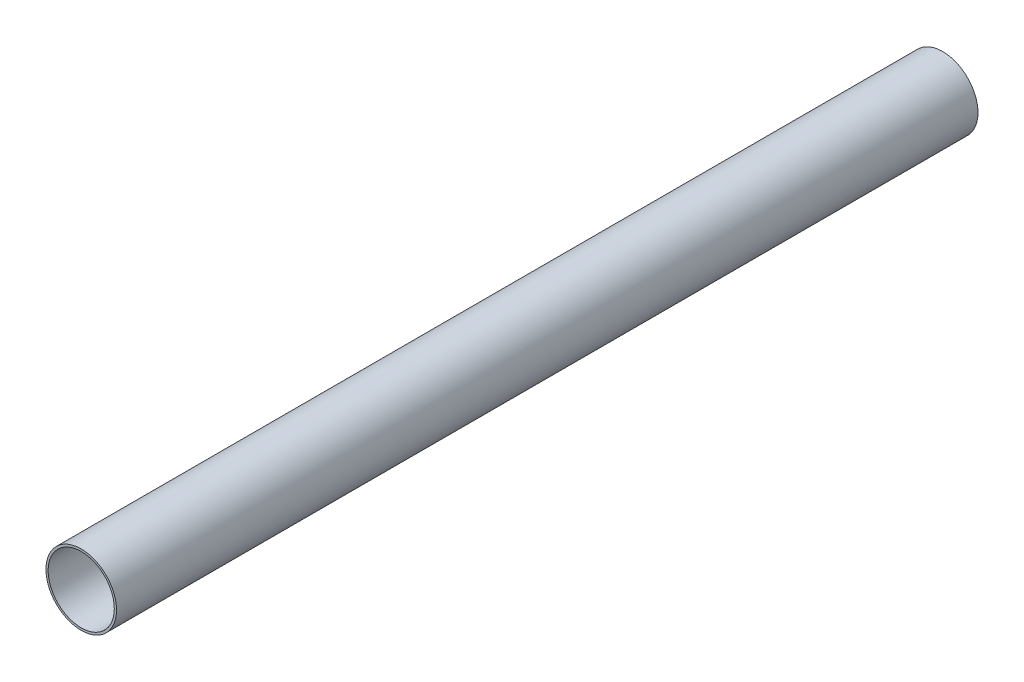
ISO-10303-21;
HEADER;
FILE_DESCRIPTION(('STEP AP214'),'2;1');
FILE_NAME('part.step','',(''),(''),'','','');
FILE_SCHEMA(('AUTOMOTIVE_DESIGN { 1 0 10303 214 1 1 1 1 }'));
ENDSEC;
DATA;
#1=APPLICATION_CONTEXT('core data for automotive mechanical design processes');
#2=APPLICATION_PROTOCOL_DEFINITION('international standard','automotive_design',2000,#1);
#3=PRODUCT_CONTEXT('',#1,'mechanical');
#4=PRODUCT('Part','Part','',(#3));
#5=PRODUCT_RELATED_PRODUCT_CATEGORY('part','',(#4));
#6=PRODUCT_DEFINITION_FORMATION('','',#4);
#7=PRODUCT_DEFINITION_CONTEXT('part definition',#1,'design');
#8=PRODUCT_DEFINITION('design','',#6,#7);
#9=PRODUCT_DEFINITION_SHAPE('','',#8);
#10=(LENGTH_UNIT() NAMED_UNIT(*) SI_UNIT(.MILLI.,.METRE.));
#11=(NAMED_UNIT(*) PLANE_ANGLE_UNIT() SI_UNIT($,.RADIAN.));
#12=(NAMED_UNIT(*) SI_UNIT($,.STERADIAN.) SOLID_ANGLE_UNIT());
#13=UNCERTAINTY_MEASURE_WITH_UNIT(LENGTH_MEASURE(1.E-05),#10,'distance_accuracy_value','');
#14=(GEOMETRIC_REPRESENTATION_CONTEXT(3) GLOBAL_UNCERTAINTY_ASSIGNED_CONTEXT((#13)) GLOBAL_UNIT_ASSIGNED_CONTEXT((#10,
#11,#12)) REPRESENTATION_CONTEXT('',''));
#15=CARTESIAN_POINT('',(0.,0.,0.));
#16=DIRECTION('',(0.,0.,1.));
#17=DIRECTION('',(1.,0.,0.));
#18=AXIS2_PLACEMENT_3D('',#15,#16,#17);
#19=CARTESIAN_POINT('',(0.,0.,1241.2726));
#20=DIRECTION('',(0.,0.,1.));
#21=DIRECTION('',(1.,0.,0.));
#22=AXIS2_PLACEMENT_3D('',#19,#20,#21);
#23=PLANE('',#22);
#24=CARTESIAN_POINT('',(0.,0.,1241.2726));
#25=DIRECTION('',(0.,0.,1.));
#26=DIRECTION('',(1.,0.,0.));
#27=AXIS2_PLACEMENT_3D('',#24,#25,#26);
#28=CIRCLE('',#27,50.8381);
#29=CARTESIAN_POINT('',(50.8381,0.,1241.2726));
#30=VERTEX_POINT('',#29);
#31=EDGE_CURVE('E10',#30,#30,#28,.T.);
#32=ORIENTED_EDGE('',*,*,#31,.T.);
#33=EDGE_LOOP('',(#32));
#34=FACE_BOUND('',#33,.T.);
#35=CARTESIAN_POINT('',(0.,0.,1241.2726));
#36=DIRECTION('',(0.,0.,1.));
#37=DIRECTION('',(1.,0.,0.));
#38=AXIS2_PLACEMENT_3D('',#35,#36,#37);
#39=CIRCLE('',#38,47.6631);
#40=CARTESIAN_POINT('',(47.6631,0.,1241.2726));
#41=VERTEX_POINT('',#40);
#42=EDGE_CURVE('E41',#41,#41,#39,.T.);
#43=ORIENTED_EDGE('',*,*,#42,.F.);
#44=EDGE_LOOP('',(#43));
#45=FACE_BOUND('',#44,.T.);
#46=ADVANCED_FACE('F30',(#34,#45),#23,.T.);
#47=CARTESIAN_POINT('',(0.,0.,0.));
#48=DIRECTION('',(0.,0.,1.));
#49=DIRECTION('',(1.,0.,0.));
#50=AXIS2_PLACEMENT_3D('',#47,#48,#49);
#51=PLANE('',#50);
#52=CARTESIAN_POINT('',(0.,0.,0.));
#53=DIRECTION('',(0.,0.,1.));
#54=DIRECTION('',(1.,0.,0.));
#55=AXIS2_PLACEMENT_3D('',#52,#53,#54);
#56=CIRCLE('',#55,50.8381);
#57=CARTESIAN_POINT('',(50.8381,0.,0.));
#58=VERTEX_POINT('',#57);
#59=EDGE_CURVE('E34',#58,#58,#56,.T.);
#60=ORIENTED_EDGE('',*,*,#59,.F.);
#61=EDGE_LOOP('',(#60));
#62=FACE_BOUND('',#61,.T.);
#63=CARTESIAN_POINT('',(0.,0.,0.));
#64=DIRECTION('',(0.,0.,1.));
#65=DIRECTION('',(1.,0.,0.));
#66=AXIS2_PLACEMENT_3D('',#63,#64,#65);
#67=CIRCLE('',#66,47.6631);
#68=CARTESIAN_POINT('',(47.6631,0.,0.));
#69=VERTEX_POINT('',#68);
#70=EDGE_CURVE('E43',#69,#69,#67,.T.);
#71=ORIENTED_EDGE('',*,*,#70,.T.);
#72=EDGE_LOOP('',(#71));
#73=FACE_BOUND('',#72,.T.);
#74=ADVANCED_FACE('F53',(#62,#73),#51,.F.);
#75=CARTESIAN_POINT('',(0.,0.,1241.2726));
#76=DIRECTION('',(0.,0.,-1.));
#77=DIRECTION('',(-1.,0.,0.));
#78=AXIS2_PLACEMENT_3D('',#75,#76,#77);
#79=CYLINDRICAL_SURFACE('',#78,50.8381);
#80=ORIENTED_EDGE('',*,*,#31,.F.);
#81=EDGE_LOOP('',(#80));
#82=FACE_BOUND('',#81,.T.);
#83=ORIENTED_EDGE('',*,*,#59,.T.);
#84=EDGE_LOOP('',(#83));
#85=FACE_BOUND('',#84,.T.);
#86=ADVANCED_FACE('F32',(#82,#85),#79,.T.);
#87=CARTESIAN_POINT('',(0.,0.,1241.2726));
#88=DIRECTION('',(0.,0.,-1.));
#89=DIRECTION('',(-1.,0.,0.));
#90=AXIS2_PLACEMENT_3D('',#87,#88,#89);
#91=CYLINDRICAL_SURFACE('',#90,47.6631);
#92=ORIENTED_EDGE('',*,*,#42,.T.);
#93=EDGE_LOOP('',(#92));
#94=FACE_BOUND('',#93,.T.);
#95=ORIENTED_EDGE('',*,*,#70,.F.);
#96=EDGE_LOOP('',(#95));
#97=FACE_BOUND('',#96,.T.);
#98=ADVANCED_FACE('F49',(#94,#97),#91,.F.);
#99=CLOSED_SHELL('',(#46,#74,#86,#98));
#100=MANIFOLD_SOLID_BREP('B2',#99);
#101=ADVANCED_BREP_SHAPE_REPRESENTATION('',(#18,#100),#14);
#102=SHAPE_DEFINITION_REPRESENTATION(#9,#101);
ENDSEC;
END-ISO-10303-21;
